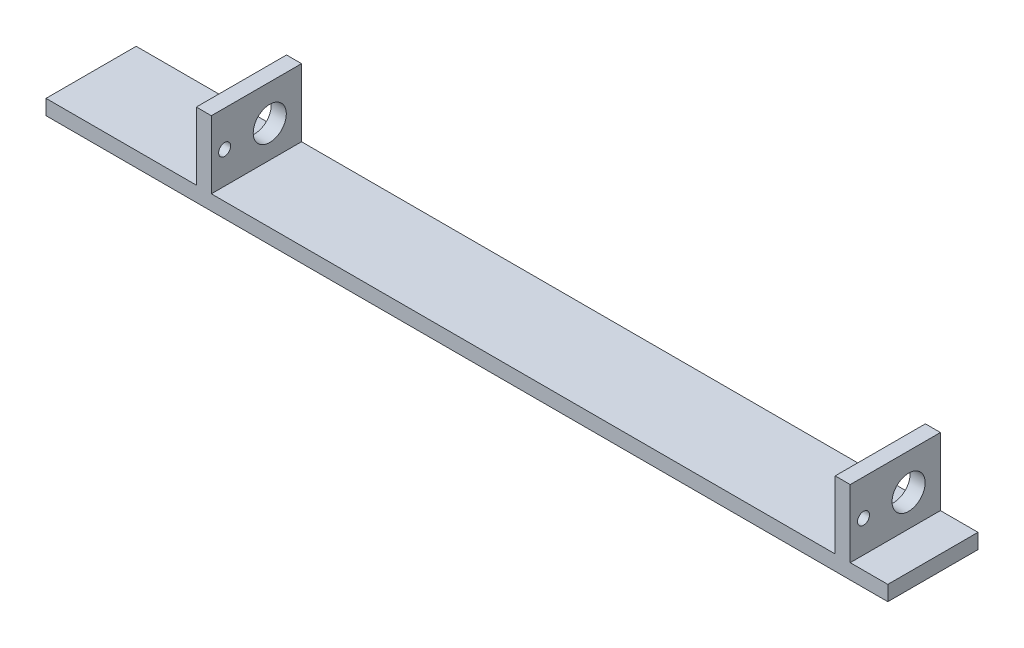
ISO-10303-21;
HEADER;
FILE_DESCRIPTION(('STEP AP214'),'2;1');
FILE_NAME('part.step','',(''),(''),'','','');
FILE_SCHEMA(('AUTOMOTIVE_DESIGN { 1 0 10303 214 1 1 1 1 }'));
ENDSEC;
DATA;
#1=APPLICATION_CONTEXT('core data for automotive mechanical design processes');
#2=APPLICATION_PROTOCOL_DEFINITION('international standard','automotive_design',2000,#1);
#3=PRODUCT_CONTEXT('',#1,'mechanical');
#4=PRODUCT('Part','Part','',(#3));
#5=PRODUCT_RELATED_PRODUCT_CATEGORY('part','',(#4));
#6=PRODUCT_DEFINITION_FORMATION('','',#4);
#7=PRODUCT_DEFINITION_CONTEXT('part definition',#1,'design');
#8=PRODUCT_DEFINITION('design','',#6,#7);
#9=PRODUCT_DEFINITION_SHAPE('','',#8);
#10=(LENGTH_UNIT() NAMED_UNIT(*) SI_UNIT(.MILLI.,.METRE.));
#11=(NAMED_UNIT(*) PLANE_ANGLE_UNIT() SI_UNIT($,.RADIAN.));
#12=(NAMED_UNIT(*) SI_UNIT($,.STERADIAN.) SOLID_ANGLE_UNIT());
#13=UNCERTAINTY_MEASURE_WITH_UNIT(LENGTH_MEASURE(1.E-05),#10,'distance_accuracy_value','');
#14=(GEOMETRIC_REPRESENTATION_CONTEXT(3) GLOBAL_UNCERTAINTY_ASSIGNED_CONTEXT((#13)) GLOBAL_UNIT_ASSIGNED_CONTEXT((#10,
#11,#12)) REPRESENTATION_CONTEXT('',''));
#15=CARTESIAN_POINT('',(0.,0.,0.));
#16=DIRECTION('',(0.,0.,1.));
#17=DIRECTION('',(1.,0.,0.));
#18=AXIS2_PLACEMENT_3D('',#15,#16,#17);
#19=CARTESIAN_POINT('',(0.,10.,0.));
#20=DIRECTION('',(0.,1.,0.));
#21=DIRECTION('',(0.,0.,1.));
#22=AXIS2_PLACEMENT_3D('',#19,#20,#21);
#23=PLANE('',#22);
#24=DIRECTION('',(1.,0.,0.));
#25=VECTOR('',#24,1.);
#26=CARTESIAN_POINT('',(-280.,10.,30.));
#27=LINE('',#26,#25);
#28=CARTESIAN_POINT('',(-170.,10.,30.));
#29=VERTEX_POINT('',#28);
#30=CARTESIAN_POINT('',(245.,10.,30.));
#31=VERTEX_POINT('',#30);
#32=EDGE_CURVE('E192',#29,#31,#27,.T.);
#33=ORIENTED_EDGE('',*,*,#32,.T.);
#34=DIRECTION('',(0.,0.,1.));
#35=VECTOR('',#34,1.);
#36=CARTESIAN_POINT('',(245.,10.,30.));
#37=LINE('',#36,#35);
#38=CARTESIAN_POINT('',(245.,10.,-30.));
#39=VERTEX_POINT('',#38);
#40=EDGE_CURVE('E50',#39,#31,#37,.T.);
#41=ORIENTED_EDGE('',*,*,#40,.F.);
#42=DIRECTION('',(-1.,0.,0.));
#43=VECTOR('',#42,1.);
#44=CARTESIAN_POINT('',(-280.,10.,-30.));
#45=LINE('',#44,#43);
#46=CARTESIAN_POINT('',(-170.,10.,-30.));
#47=VERTEX_POINT('',#46);
#48=EDGE_CURVE('E148',#39,#47,#45,.T.);
#49=ORIENTED_EDGE('',*,*,#48,.T.);
#50=DIRECTION('',(0.,0.,-1.));
#51=VECTOR('',#50,1.);
#52=CARTESIAN_POINT('',(-170.,10.,30.));
#53=LINE('',#52,#51);
#54=EDGE_CURVE('E152',#29,#47,#53,.T.);
#55=ORIENTED_EDGE('',*,*,#54,.F.);
#56=EDGE_LOOP('',(#33,#41,#49,#55));
#57=FACE_BOUND('',#56,.T.);
#58=ADVANCED_FACE('F35',(#57),#23,.T.);
#59=CARTESIAN_POINT('',(280.,10.,-30.));
#60=VERTEX_POINT('',#59);
#61=CARTESIAN_POINT('',(255.,10.,-30.));
#62=VERTEX_POINT('',#61);
#63=EDGE_CURVE('E58',#60,#62,#45,.T.);
#64=ORIENTED_EDGE('',*,*,#63,.T.);
#65=DIRECTION('',(0.,0.,-1.));
#66=VECTOR('',#65,1.);
#67=CARTESIAN_POINT('',(255.,10.,-30.));
#68=LINE('',#67,#66);
#69=CARTESIAN_POINT('',(255.,10.,30.));
#70=VERTEX_POINT('',#69);
#71=EDGE_CURVE('E144',#70,#62,#68,.T.);
#72=ORIENTED_EDGE('',*,*,#71,.F.);
#73=CARTESIAN_POINT('',(280.,10.,30.));
#74=VERTEX_POINT('',#73);
#75=EDGE_CURVE('E188',#70,#74,#27,.T.);
#76=ORIENTED_EDGE('',*,*,#75,.T.);
#77=DIRECTION('',(0.,0.,-1.));
#78=VECTOR('',#77,1.);
#79=CARTESIAN_POINT('',(280.,10.,-30.));
#80=LINE('',#79,#78);
#81=EDGE_CURVE('E181',#74,#60,#80,.T.);
#82=ORIENTED_EDGE('',*,*,#81,.T.);
#83=EDGE_LOOP('',(#64,#72,#76,#82));
#84=FACE_BOUND('',#83,.T.);
#85=ADVANCED_FACE('F251',(#84),#23,.T.);
#86=CARTESIAN_POINT('',(280.,10.,-30.));
#87=DIRECTION('',(-1.,0.,0.));
#88=DIRECTION('',(0.,0.,1.));
#89=AXIS2_PLACEMENT_3D('',#86,#87,#88);
#90=PLANE('',#89);
#91=DIRECTION('',(0.,0.,-1.));
#92=VECTOR('',#91,1.);
#93=CARTESIAN_POINT('',(280.,0.,-30.));
#94=LINE('',#93,#92);
#95=CARTESIAN_POINT('',(280.,0.,30.));
#96=VERTEX_POINT('',#95);
#97=CARTESIAN_POINT('',(280.,0.,-30.));
#98=VERTEX_POINT('',#97);
#99=EDGE_CURVE('E180',#96,#98,#94,.T.);
#100=ORIENTED_EDGE('',*,*,#99,.T.);
#101=DIRECTION('',(0.,-1.,0.));
#102=VECTOR('',#101,1.);
#103=CARTESIAN_POINT('',(280.,10.,-30.));
#104=LINE('',#103,#102);
#105=EDGE_CURVE('E208',#60,#98,#104,.T.);
#106=ORIENTED_EDGE('',*,*,#105,.F.);
#107=ORIENTED_EDGE('',*,*,#81,.F.);
#108=DIRECTION('',(0.,-1.,0.));
#109=VECTOR('',#108,1.);
#110=CARTESIAN_POINT('',(280.,10.,30.));
#111=LINE('',#110,#109);
#112=EDGE_CURVE('E191',#74,#96,#111,.T.);
#113=ORIENTED_EDGE('',*,*,#112,.T.);
#114=EDGE_LOOP('',(#100,#106,#107,#113));
#115=FACE_BOUND('',#114,.T.);
#116=ADVANCED_FACE('F37',(#115),#90,.F.);
#117=CARTESIAN_POINT('',(-280.,10.,-30.));
#118=DIRECTION('',(0.,0.,1.));
#119=DIRECTION('',(1.,0.,0.));
#120=AXIS2_PLACEMENT_3D('',#117,#118,#119);
#121=PLANE('',#120);
#122=DIRECTION('',(-1.,0.,0.));
#123=VECTOR('',#122,1.);
#124=CARTESIAN_POINT('',(-280.,0.,-30.));
#125=LINE('',#124,#123);
#126=CARTESIAN_POINT('',(-280.,0.,-30.));
#127=VERTEX_POINT('',#126);
#128=EDGE_CURVE('E195',#98,#127,#125,.T.);
#129=ORIENTED_EDGE('',*,*,#128,.T.);
#130=DIRECTION('',(0.,-1.,0.));
#131=VECTOR('',#130,1.);
#132=CARTESIAN_POINT('',(-280.,10.,-30.));
#133=LINE('',#132,#131);
#134=CARTESIAN_POINT('',(-280.,10.,-30.));
#135=VERTEX_POINT('',#134);
#136=EDGE_CURVE('E205',#135,#127,#133,.T.);
#137=ORIENTED_EDGE('',*,*,#136,.F.);
#138=CARTESIAN_POINT('',(-180.,10.,-30.));
#139=VERTEX_POINT('',#138);
#140=EDGE_CURVE('E183',#139,#135,#45,.T.);
#141=ORIENTED_EDGE('',*,*,#140,.F.);
#142=DIRECTION('',(0.,-1.,0.));
#143=VECTOR('',#142,1.);
#144=CARTESIAN_POINT('',(-180.,55.,-30.));
#145=LINE('',#144,#143);
#146=CARTESIAN_POINT('',(-180.,55.,-30.));
#147=VERTEX_POINT('',#146);
#148=EDGE_CURVE('E177',#147,#139,#145,.T.);
#149=ORIENTED_EDGE('',*,*,#148,.F.);
#150=DIRECTION('',(-1.,0.,0.));
#151=VECTOR('',#150,1.);
#152=CARTESIAN_POINT('',(-170.,55.,-30.));
#153=LINE('',#152,#151);
#154=CARTESIAN_POINT('',(-170.,55.,-30.));
#155=VERTEX_POINT('',#154);
#156=EDGE_CURVE('E158',#155,#147,#153,.T.);
#157=ORIENTED_EDGE('',*,*,#156,.F.);
#158=DIRECTION('',(0.,-1.,0.));
#159=VECTOR('',#158,1.);
#160=CARTESIAN_POINT('',(-170.,55.,-30.));
#161=LINE('',#160,#159);
#162=EDGE_CURVE('E166',#155,#47,#161,.T.);
#163=ORIENTED_EDGE('',*,*,#162,.T.);
#164=ORIENTED_EDGE('',*,*,#48,.F.);
#165=DIRECTION('',(0.,-1.,0.));
#166=VECTOR('',#165,1.);
#167=CARTESIAN_POINT('',(245.,55.,-30.));
#168=LINE('',#167,#166);
#169=CARTESIAN_POINT('',(245.,55.,-30.));
#170=VERTEX_POINT('',#169);
#171=EDGE_CURVE('E129',#170,#39,#168,.T.);
#172=ORIENTED_EDGE('',*,*,#171,.F.);
#173=DIRECTION('',(-1.,0.,0.));
#174=VECTOR('',#173,1.);
#175=CARTESIAN_POINT('',(245.,55.,-30.));
#176=LINE('',#175,#174);
#177=CARTESIAN_POINT('',(255.,55.,-30.));
#178=VERTEX_POINT('',#177);
#179=EDGE_CURVE('E135',#178,#170,#176,.T.);
#180=ORIENTED_EDGE('',*,*,#179,.F.);
#181=DIRECTION('',(0.,-1.,0.));
#182=VECTOR('',#181,1.);
#183=CARTESIAN_POINT('',(255.,55.,-30.));
#184=LINE('',#183,#182);
#185=EDGE_CURVE('E250',#178,#62,#184,.T.);
#186=ORIENTED_EDGE('',*,*,#185,.T.);
#187=ORIENTED_EDGE('',*,*,#63,.F.);
#188=ORIENTED_EDGE('',*,*,#105,.T.);
#189=EDGE_LOOP('',(#129,#137,#141,#149,#157,#163,#164,#172,#180,#186,#187,#188));
#190=FACE_BOUND('',#189,.T.);
#191=ADVANCED_FACE('F146',(#190),#121,.F.);
#192=CARTESIAN_POINT('',(-280.,10.,-30.));
#193=DIRECTION('',(1.,0.,0.));
#194=DIRECTION('',(0.,0.,-1.));
#195=AXIS2_PLACEMENT_3D('',#192,#193,#194);
#196=PLANE('',#195);
#197=DIRECTION('',(0.,0.,1.));
#198=VECTOR('',#197,1.);
#199=CARTESIAN_POINT('',(-280.,0.,-30.));
#200=LINE('',#199,#198);
#201=CARTESIAN_POINT('',(-280.,0.,30.));
#202=VERTEX_POINT('',#201);
#203=EDGE_CURVE('E197',#127,#202,#200,.T.);
#204=ORIENTED_EDGE('',*,*,#203,.T.);
#205=DIRECTION('',(0.,-1.,0.));
#206=VECTOR('',#205,1.);
#207=CARTESIAN_POINT('',(-280.,10.,30.));
#208=LINE('',#207,#206);
#209=CARTESIAN_POINT('',(-280.,10.,30.));
#210=VERTEX_POINT('',#209);
#211=EDGE_CURVE('E202',#210,#202,#208,.T.);
#212=ORIENTED_EDGE('',*,*,#211,.F.);
#213=DIRECTION('',(0.,0.,1.));
#214=VECTOR('',#213,1.);
#215=CARTESIAN_POINT('',(-280.,10.,-30.));
#216=LINE('',#215,#214);
#217=EDGE_CURVE('E186',#135,#210,#216,.T.);
#218=ORIENTED_EDGE('',*,*,#217,.F.);
#219=ORIENTED_EDGE('',*,*,#136,.T.);
#220=EDGE_LOOP('',(#204,#212,#218,#219));
#221=FACE_BOUND('',#220,.T.);
#222=ADVANCED_FACE('F246',(#221),#196,.F.);
#223=CARTESIAN_POINT('',(-280.,10.,30.));
#224=DIRECTION('',(0.,0.,-1.));
#225=DIRECTION('',(-1.,0.,0.));
#226=AXIS2_PLACEMENT_3D('',#223,#224,#225);
#227=PLANE('',#226);
#228=DIRECTION('',(1.,0.,0.));
#229=VECTOR('',#228,1.);
#230=CARTESIAN_POINT('',(-280.,0.,30.));
#231=LINE('',#230,#229);
#232=EDGE_CURVE('E184',#202,#96,#231,.T.);
#233=ORIENTED_EDGE('',*,*,#232,.T.);
#234=ORIENTED_EDGE('',*,*,#112,.F.);
#235=ORIENTED_EDGE('',*,*,#75,.F.);
#236=DIRECTION('',(0.,-1.,0.));
#237=VECTOR('',#236,1.);
#238=CARTESIAN_POINT('',(255.,55.,30.));
#239=LINE('',#238,#237);
#240=CARTESIAN_POINT('',(255.,55.,30.));
#241=VERTEX_POINT('',#240);
#242=EDGE_CURVE('E154',#241,#70,#239,.T.);
#243=ORIENTED_EDGE('',*,*,#242,.F.);
#244=DIRECTION('',(1.,0.,0.));
#245=VECTOR('',#244,1.);
#246=CARTESIAN_POINT('',(255.,55.,30.));
#247=LINE('',#246,#245);
#248=CARTESIAN_POINT('',(245.,55.,30.));
#249=VERTEX_POINT('',#248);
#250=EDGE_CURVE('E134',#249,#241,#247,.T.);
#251=ORIENTED_EDGE('',*,*,#250,.F.);
#252=DIRECTION('',(0.,-1.,0.));
#253=VECTOR('',#252,1.);
#254=CARTESIAN_POINT('',(245.,55.,30.));
#255=LINE('',#254,#253);
#256=EDGE_CURVE('E131',#249,#31,#255,.T.);
#257=ORIENTED_EDGE('',*,*,#256,.T.);
#258=ORIENTED_EDGE('',*,*,#32,.F.);
#259=DIRECTION('',(0.,-1.,0.));
#260=VECTOR('',#259,1.);
#261=CARTESIAN_POINT('',(-170.,55.,30.));
#262=LINE('',#261,#260);
#263=CARTESIAN_POINT('',(-170.,55.,30.));
#264=VERTEX_POINT('',#263);
#265=EDGE_CURVE('E171',#264,#29,#262,.T.);
#266=ORIENTED_EDGE('',*,*,#265,.F.);
#267=DIRECTION('',(1.,0.,0.));
#268=VECTOR('',#267,1.);
#269=CARTESIAN_POINT('',(-180.,55.,30.));
#270=LINE('',#269,#268);
#271=CARTESIAN_POINT('',(-180.,55.,30.));
#272=VERTEX_POINT('',#271);
#273=EDGE_CURVE('E163',#272,#264,#270,.T.);
#274=ORIENTED_EDGE('',*,*,#273,.F.);
#275=DIRECTION('',(0.,-1.,0.));
#276=VECTOR('',#275,1.);
#277=CARTESIAN_POINT('',(-180.,55.,30.));
#278=LINE('',#277,#276);
#279=CARTESIAN_POINT('',(-180.,10.,30.));
#280=VERTEX_POINT('',#279);
#281=EDGE_CURVE('E174',#272,#280,#278,.T.);
#282=ORIENTED_EDGE('',*,*,#281,.T.);
#283=EDGE_CURVE('E189',#210,#280,#27,.T.);
#284=ORIENTED_EDGE('',*,*,#283,.F.);
#285=ORIENTED_EDGE('',*,*,#211,.T.);
#286=EDGE_LOOP('',(#233,#234,#235,#243,#251,#257,#258,#266,#274,#282,#284,#285));
#287=FACE_BOUND('',#286,.T.);
#288=ADVANCED_FACE('F240',(#287),#227,.F.);
#289=DIRECTION('',(0.,0.,1.));
#290=VECTOR('',#289,1.);
#291=CARTESIAN_POINT('',(-180.,10.,-30.));
#292=LINE('',#291,#290);
#293=EDGE_CURVE('E149',#139,#280,#292,.T.);
#294=ORIENTED_EDGE('',*,*,#293,.F.);
#295=ORIENTED_EDGE('',*,*,#140,.T.);
#296=ORIENTED_EDGE('',*,*,#217,.T.);
#297=ORIENTED_EDGE('',*,*,#283,.T.);
#298=EDGE_LOOP('',(#294,#295,#296,#297));
#299=FACE_BOUND('',#298,.T.);
#300=ADVANCED_FACE('F229',(#299),#23,.T.);
#301=CARTESIAN_POINT('',(0.,0.,0.));
#302=DIRECTION('',(0.,1.,0.));
#303=DIRECTION('',(0.,0.,1.));
#304=AXIS2_PLACEMENT_3D('',#301,#302,#303);
#305=PLANE('',#304);
#306=CARTESIAN_POINT('',(260.,0.,0.));
#307=DIRECTION('',(0.,1.,0.));
#308=DIRECTION('',(0.,0.,1.));
#309=AXIS2_PLACEMENT_3D('',#306,#307,#308);
#310=CIRCLE('',#309,4.99999999999999);
#311=CARTESIAN_POINT('',(260.,0.,4.99999999999999));
#312=VERTEX_POINT('',#311);
#313=EDGE_CURVE('E11',#312,#312,#310,.F.);
#314=ORIENTED_EDGE('',*,*,#313,.F.);
#315=EDGE_LOOP('',(#314));
#316=FACE_BOUND('',#315,.T.);
#317=CARTESIAN_POINT('',(-270.,0.,0.));
#318=DIRECTION('',(0.,1.,0.));
#319=DIRECTION('',(0.,0.,1.));
#320=AXIS2_PLACEMENT_3D('',#317,#318,#319);
#321=CIRCLE('',#320,4.99999999999999);
#322=CARTESIAN_POINT('',(-270.,0.,5.));
#323=VERTEX_POINT('',#322);
#324=EDGE_CURVE('E43',#323,#323,#321,.F.);
#325=ORIENTED_EDGE('',*,*,#324,.F.);
#326=EDGE_LOOP('',(#325));
#327=FACE_BOUND('',#326,.T.);
#328=ORIENTED_EDGE('',*,*,#99,.F.);
#329=ORIENTED_EDGE('',*,*,#232,.F.);
#330=ORIENTED_EDGE('',*,*,#203,.F.);
#331=ORIENTED_EDGE('',*,*,#128,.F.);
#332=EDGE_LOOP('',(#328,#329,#330,#331));
#333=FACE_BOUND('',#332,.T.);
#334=ADVANCED_FACE('F225',(#316,#327,#333),#305,.F.);
#335=CARTESIAN_POINT('',(-180.,55.,-30.));
#336=DIRECTION('',(1.,0.,0.));
#337=DIRECTION('',(0.,0.,-1.));
#338=AXIS2_PLACEMENT_3D('',#335,#336,#337);
#339=PLANE('',#338);
#340=CARTESIAN_POINT('',(-180.,31.15,-8.85));
#341=DIRECTION('',(-1.,0.,0.));
#342=DIRECTION('',(0.,0.,1.));
#343=AXIS2_PLACEMENT_3D('',#340,#341,#342);
#344=CIRCLE('',#343,11.);
#345=CARTESIAN_POINT('',(-180.,31.15,2.15));
#346=VERTEX_POINT('',#345);
#347=EDGE_CURVE('E215',#346,#346,#344,.T.);
#348=ORIENTED_EDGE('',*,*,#347,.F.);
#349=EDGE_LOOP('',(#348));
#350=FACE_BOUND('',#349,.T.);
#351=CARTESIAN_POINT('',(-180.,31.15,21.15));
#352=DIRECTION('',(-1.,0.,0.));
#353=DIRECTION('',(0.,0.,1.));
#354=AXIS2_PLACEMENT_3D('',#351,#352,#353);
#355=CIRCLE('',#354,4.);
#356=CARTESIAN_POINT('',(-180.,31.15,25.15));
#357=VERTEX_POINT('',#356);
#358=EDGE_CURVE('E348',#357,#357,#355,.T.);
#359=ORIENTED_EDGE('',*,*,#358,.F.);
#360=EDGE_LOOP('',(#359));
#361=FACE_BOUND('',#360,.T.);
#362=ORIENTED_EDGE('',*,*,#293,.T.);
#363=ORIENTED_EDGE('',*,*,#281,.F.);
#364=DIRECTION('',(0.,0.,1.));
#365=VECTOR('',#364,1.);
#366=CARTESIAN_POINT('',(-180.,55.,-30.));
#367=LINE('',#366,#365);
#368=EDGE_CURVE('E161',#147,#272,#367,.T.);
#369=ORIENTED_EDGE('',*,*,#368,.F.);
#370=ORIENTED_EDGE('',*,*,#148,.T.);
#371=EDGE_LOOP('',(#362,#363,#369,#370));
#372=FACE_BOUND('',#371,.T.);
#373=ADVANCED_FACE('F228',(#350,#361,#372),#339,.F.);
#374=CARTESIAN_POINT('',(-170.,55.,30.));
#375=DIRECTION('',(-1.,0.,0.));
#376=DIRECTION('',(0.,0.,1.));
#377=AXIS2_PLACEMENT_3D('',#374,#375,#376);
#378=PLANE('',#377);
#379=CARTESIAN_POINT('',(-170.,31.15,-8.85));
#380=DIRECTION('',(-1.,0.,0.));
#381=DIRECTION('',(0.,0.,1.));
#382=AXIS2_PLACEMENT_3D('',#379,#380,#381);
#383=CIRCLE('',#382,11.);
#384=CARTESIAN_POINT('',(-170.,31.15,2.15));
#385=VERTEX_POINT('',#384);
#386=EDGE_CURVE('E255',#385,#385,#383,.T.);
#387=ORIENTED_EDGE('',*,*,#386,.T.);
#388=EDGE_LOOP('',(#387));
#389=FACE_BOUND('',#388,.T.);
#390=CARTESIAN_POINT('',(-170.,31.15,21.15));
#391=DIRECTION('',(-1.,0.,0.));
#392=DIRECTION('',(0.,0.,1.));
#393=AXIS2_PLACEMENT_3D('',#390,#391,#392);
#394=CIRCLE('',#393,4.);
#395=CARTESIAN_POINT('',(-170.,31.15,25.15));
#396=VERTEX_POINT('',#395);
#397=EDGE_CURVE('E219',#396,#396,#394,.T.);
#398=ORIENTED_EDGE('',*,*,#397,.T.);
#399=EDGE_LOOP('',(#398));
#400=FACE_BOUND('',#399,.T.);
#401=ORIENTED_EDGE('',*,*,#54,.T.);
#402=ORIENTED_EDGE('',*,*,#162,.F.);
#403=DIRECTION('',(0.,0.,-1.));
#404=VECTOR('',#403,1.);
#405=CARTESIAN_POINT('',(-170.,55.,30.));
#406=LINE('',#405,#404);
#407=EDGE_CURVE('E165',#264,#155,#406,.T.);
#408=ORIENTED_EDGE('',*,*,#407,.F.);
#409=ORIENTED_EDGE('',*,*,#265,.T.);
#410=EDGE_LOOP('',(#401,#402,#408,#409));
#411=FACE_BOUND('',#410,.T.);
#412=ADVANCED_FACE('F297',(#389,#400,#411),#378,.F.);
#413=CARTESIAN_POINT('',(0.,55.,0.));
#414=DIRECTION('',(0.,1.,0.));
#415=DIRECTION('',(0.,0.,1.));
#416=AXIS2_PLACEMENT_3D('',#413,#414,#415);
#417=PLANE('',#416);
#418=ORIENTED_EDGE('',*,*,#156,.T.);
#419=ORIENTED_EDGE('',*,*,#368,.T.);
#420=ORIENTED_EDGE('',*,*,#273,.T.);
#421=ORIENTED_EDGE('',*,*,#407,.T.);
#422=EDGE_LOOP('',(#418,#419,#420,#421));
#423=FACE_BOUND('',#422,.T.);
#424=ADVANCED_FACE('F272',(#423),#417,.T.);
#425=CARTESIAN_POINT('',(245.,55.,30.));
#426=DIRECTION('',(1.,0.,0.));
#427=DIRECTION('',(0.,0.,-1.));
#428=AXIS2_PLACEMENT_3D('',#425,#426,#427);
#429=PLANE('',#428);
#430=CARTESIAN_POINT('',(245.,31.15,-8.85));
#431=DIRECTION('',(1.,0.,0.));
#432=DIRECTION('',(0.,0.,-1.));
#433=AXIS2_PLACEMENT_3D('',#430,#431,#432);
#434=CIRCLE('',#433,11.);
#435=CARTESIAN_POINT('',(245.,31.15,2.15));
#436=VERTEX_POINT('',#435);
#437=EDGE_CURVE('E218',#436,#436,#434,.T.);
#438=ORIENTED_EDGE('',*,*,#437,.T.);
#439=EDGE_LOOP('',(#438));
#440=FACE_BOUND('',#439,.T.);
#441=CARTESIAN_POINT('',(245.,31.15,21.15));
#442=DIRECTION('',(1.,0.,0.));
#443=DIRECTION('',(0.,0.,-1.));
#444=AXIS2_PLACEMENT_3D('',#441,#442,#443);
#445=CIRCLE('',#444,4.);
#446=CARTESIAN_POINT('',(245.,31.15,25.15));
#447=VERTEX_POINT('',#446);
#448=EDGE_CURVE('E214',#447,#447,#445,.T.);
#449=ORIENTED_EDGE('',*,*,#448,.T.);
#450=EDGE_LOOP('',(#449));
#451=FACE_BOUND('',#450,.T.);
#452=ORIENTED_EDGE('',*,*,#40,.T.);
#453=ORIENTED_EDGE('',*,*,#256,.F.);
#454=DIRECTION('',(0.,0.,1.));
#455=VECTOR('',#454,1.);
#456=CARTESIAN_POINT('',(245.,55.,30.));
#457=LINE('',#456,#455);
#458=EDGE_CURVE('E125',#170,#249,#457,.T.);
#459=ORIENTED_EDGE('',*,*,#458,.F.);
#460=ORIENTED_EDGE('',*,*,#171,.T.);
#461=EDGE_LOOP('',(#452,#453,#459,#460));
#462=FACE_BOUND('',#461,.T.);
#463=ADVANCED_FACE('F127',(#440,#451,#462),#429,.F.);
#464=CARTESIAN_POINT('',(255.,55.,-30.));
#465=DIRECTION('',(-1.,0.,0.));
#466=DIRECTION('',(0.,0.,1.));
#467=AXIS2_PLACEMENT_3D('',#464,#465,#466);
#468=PLANE('',#467);
#469=CARTESIAN_POINT('',(255.,31.15,-8.85));
#470=DIRECTION('',(-1.,0.,0.));
#471=DIRECTION('',(0.,0.,1.));
#472=AXIS2_PLACEMENT_3D('',#469,#470,#471);
#473=CIRCLE('',#472,11.);
#474=CARTESIAN_POINT('',(255.,31.15,2.15));
#475=VERTEX_POINT('',#474);
#476=EDGE_CURVE('E216',#475,#475,#473,.T.);
#477=ORIENTED_EDGE('',*,*,#476,.T.);
#478=EDGE_LOOP('',(#477));
#479=FACE_BOUND('',#478,.T.);
#480=CARTESIAN_POINT('',(255.,31.15,21.15));
#481=DIRECTION('',(-1.,0.,0.));
#482=DIRECTION('',(0.,0.,1.));
#483=AXIS2_PLACEMENT_3D('',#480,#481,#482);
#484=CIRCLE('',#483,4.);
#485=CARTESIAN_POINT('',(255.,31.15,25.15));
#486=VERTEX_POINT('',#485);
#487=EDGE_CURVE('E211',#486,#486,#484,.T.);
#488=ORIENTED_EDGE('',*,*,#487,.T.);
#489=EDGE_LOOP('',(#488));
#490=FACE_BOUND('',#489,.T.);
#491=ORIENTED_EDGE('',*,*,#71,.T.);
#492=ORIENTED_EDGE('',*,*,#185,.F.);
#493=DIRECTION('',(0.,0.,-1.));
#494=VECTOR('',#493,1.);
#495=CARTESIAN_POINT('',(255.,55.,-30.));
#496=LINE('',#495,#494);
#497=EDGE_CURVE('E140',#241,#178,#496,.T.);
#498=ORIENTED_EDGE('',*,*,#497,.F.);
#499=ORIENTED_EDGE('',*,*,#242,.T.);
#500=EDGE_LOOP('',(#491,#492,#498,#499));
#501=FACE_BOUND('',#500,.T.);
#502=ADVANCED_FACE('F262',(#479,#490,#501),#468,.F.);
#503=CARTESIAN_POINT('',(0.,55.,0.));
#504=DIRECTION('',(0.,-1.,0.));
#505=DIRECTION('',(0.,0.,-1.));
#506=AXIS2_PLACEMENT_3D('',#503,#504,#505);
#507=PLANE('',#506);
#508=ORIENTED_EDGE('',*,*,#179,.T.);
#509=ORIENTED_EDGE('',*,*,#458,.T.);
#510=ORIENTED_EDGE('',*,*,#250,.T.);
#511=ORIENTED_EDGE('',*,*,#497,.T.);
#512=EDGE_LOOP('',(#508,#509,#510,#511));
#513=FACE_BOUND('',#512,.T.);
#514=ADVANCED_FACE('F138',(#513),#507,.F.);
#515=CARTESIAN_POINT('',(260.,31.15,21.15));
#516=DIRECTION('',(-1.,0.,0.));
#517=DIRECTION('',(0.,0.,1.));
#518=AXIS2_PLACEMENT_3D('',#515,#516,#517);
#519=CYLINDRICAL_SURFACE('',#518,4.);
#520=CARTESIAN_POINT('',(255.,31.15,25.15));
#521=CARTESIAN_POINT('',(254.895833333333,31.15,25.15));
#522=CARTESIAN_POINT('',(254.791666666667,31.15,25.15));
#523=CARTESIAN_POINT('',(254.583333333333,31.15,25.15));
#524=CARTESIAN_POINT('',(254.479166666667,31.15,25.15));
#525=CARTESIAN_POINT('',(254.270833333333,31.15,25.15));
#526=CARTESIAN_POINT('',(254.166666666667,31.15,25.15));
#527=CARTESIAN_POINT('',(253.958333333333,31.15,25.15));
#528=CARTESIAN_POINT('',(253.854166666667,31.15,25.15));
#529=CARTESIAN_POINT('',(253.645833333333,31.15,25.15));
#530=CARTESIAN_POINT('',(253.541666666667,31.15,25.15));
#531=CARTESIAN_POINT('',(253.333333333333,31.15,25.15));
#532=CARTESIAN_POINT('',(253.229166666667,31.15,25.15));
#533=CARTESIAN_POINT('',(253.020833333333,31.15,25.15));
#534=CARTESIAN_POINT('',(252.916666666667,31.15,25.15));
#535=CARTESIAN_POINT('',(252.708333333333,31.15,25.15));
#536=CARTESIAN_POINT('',(252.604166666667,31.15,25.15));
#537=CARTESIAN_POINT('',(252.395833333333,31.15,25.15));
#538=CARTESIAN_POINT('',(252.291666666667,31.15,25.15));
#539=CARTESIAN_POINT('',(252.083333333333,31.15,25.15));
#540=CARTESIAN_POINT('',(251.979166666667,31.15,25.15));
#541=CARTESIAN_POINT('',(251.770833333333,31.15,25.15));
#542=CARTESIAN_POINT('',(251.666666666667,31.15,25.15));
#543=CARTESIAN_POINT('',(251.458333333333,31.15,25.15));
#544=CARTESIAN_POINT('',(251.354166666667,31.15,25.15));
#545=CARTESIAN_POINT('',(251.145833333333,31.15,25.15));
#546=CARTESIAN_POINT('',(251.041666666667,31.15,25.15));
#547=CARTESIAN_POINT('',(250.833333333333,31.15,25.15));
#548=CARTESIAN_POINT('',(250.729166666667,31.15,25.15));
#549=CARTESIAN_POINT('',(250.520833333333,31.15,25.15));
#550=CARTESIAN_POINT('',(250.416666666667,31.15,25.15));
#551=CARTESIAN_POINT('',(250.208333333333,31.15,25.15));
#552=CARTESIAN_POINT('',(250.104166666667,31.15,25.15));
#553=CARTESIAN_POINT('',(249.895833333333,31.15,25.15));
#554=CARTESIAN_POINT('',(249.791666666667,31.15,25.15));
#555=CARTESIAN_POINT('',(249.583333333333,31.15,25.15));
#556=CARTESIAN_POINT('',(249.479166666667,31.15,25.15));
#557=CARTESIAN_POINT('',(249.270833333333,31.15,25.15));
#558=CARTESIAN_POINT('',(249.166666666667,31.15,25.15));
#559=CARTESIAN_POINT('',(248.958333333333,31.15,25.15));
#560=CARTESIAN_POINT('',(248.854166666667,31.15,25.15));
#561=CARTESIAN_POINT('',(248.645833333333,31.15,25.15));
#562=CARTESIAN_POINT('',(248.541666666667,31.15,25.15));
#563=CARTESIAN_POINT('',(248.333333333333,31.15,25.15));
#564=CARTESIAN_POINT('',(248.229166666667,31.15,25.15));
#565=CARTESIAN_POINT('',(248.020833333333,31.15,25.15));
#566=CARTESIAN_POINT('',(247.916666666667,31.15,25.15));
#567=CARTESIAN_POINT('',(247.708333333333,31.15,25.15));
#568=CARTESIAN_POINT('',(247.604166666667,31.15,25.15));
#569=CARTESIAN_POINT('',(247.395833333333,31.15,25.15));
#570=CARTESIAN_POINT('',(247.291666666667,31.15,25.15));
#571=CARTESIAN_POINT('',(247.083333333333,31.15,25.15));
#572=CARTESIAN_POINT('',(246.979166666667,31.15,25.15));
#573=CARTESIAN_POINT('',(246.770833333333,31.15,25.15));
#574=CARTESIAN_POINT('',(246.666666666667,31.15,25.15));
#575=CARTESIAN_POINT('',(246.458333333333,31.15,25.15));
#576=CARTESIAN_POINT('',(246.354166666667,31.15,25.15));
#577=CARTESIAN_POINT('',(246.145833333333,31.15,25.15));
#578=CARTESIAN_POINT('',(246.041666666667,31.15,25.15));
#579=CARTESIAN_POINT('',(245.833333333333,31.15,25.15));
#580=CARTESIAN_POINT('',(245.729166666667,31.15,25.15));
#581=CARTESIAN_POINT('',(245.520833333333,31.15,25.15));
#582=CARTESIAN_POINT('',(245.416666666667,31.15,25.15));
#583=CARTESIAN_POINT('',(245.208333333333,31.15,25.15));
#584=CARTESIAN_POINT('',(245.104166666667,31.15,25.15));
#585=CARTESIAN_POINT('',(245.,31.15,25.15));
#586=B_SPLINE_CURVE_WITH_KNOTS('',3,(#520,#521,#522,#523,#524,#525,#526,#527,#528,#529,#530,
#531,#532,#533,#534,#535,#536,#537,#538,#539,#540,#541,#542,#543,#544,#545,#546,#547,#548,#549,
#550,#551,#552,#553,#554,#555,#556,#557,#558,#559,#560,#561,#562,#563,#564,#565,#566,#567,#568,
#569,#570,#571,#572,#573,#574,#575,#576,#577,#578,#579,#580,#581,#582,#583,#584,#585),
.UNSPECIFIED.,.F.,.F.,(4,2,2,2,2,2,2,2,2,2,2,2,2,2,2,2,2,2,2,2,2,2,2,2,2,2,2,2,2,2,2,2,4),(0.,
0.312499999999993,0.624999999999987,0.93749999999998,1.24999999999997,1.56249999999997,
1.87499999999996,2.18750000000001,2.5,2.8125,3.12499999999999,3.43749999999998,3.74999999999998,
4.06249999999997,4.37500000000002,4.68750000000001,5.,5.3125,5.62499999999999,5.93750000000001,
6.25000000000001,6.5625,6.87500000000002,7.18750000000001,7.50000000000001,7.8125,
8.12500000000002,8.43750000000001,8.75000000000001,9.06250000000003,9.37500000000002,
9.68750000000002,10.),.UNSPECIFIED.);
#587=EDGE_CURVE('BSEAM270',#486,#447,#586,.T.);
#588=ORIENTED_EDGE('',*,*,#487,.F.);
#589=ORIENTED_EDGE('',*,*,#448,.F.);
#590=ORIENTED_EDGE('',*,*,#587,.T.);
#591=ORIENTED_EDGE('',*,*,#587,.F.);
#592=EDGE_LOOP('',(#588,#590,#589,#591));
#593=FACE_BOUND('',#592,.T.);
#594=ADVANCED_FACE('F270',(#593),#519,.F.);
#595=CARTESIAN_POINT('',(260.,31.15,-8.85));
#596=DIRECTION('',(-1.,0.,0.));
#597=DIRECTION('',(0.,0.,1.));
#598=AXIS2_PLACEMENT_3D('',#595,#596,#597);
#599=CYLINDRICAL_SURFACE('',#598,11.);
#600=CARTESIAN_POINT('',(255.,31.15,2.15));
#601=CARTESIAN_POINT('',(254.895833333333,31.15,2.15));
#602=CARTESIAN_POINT('',(254.791666666667,31.15,2.15));
#603=CARTESIAN_POINT('',(254.583333333333,31.15,2.15));
#604=CARTESIAN_POINT('',(254.479166666667,31.15,2.15));
#605=CARTESIAN_POINT('',(254.270833333333,31.15,2.15));
#606=CARTESIAN_POINT('',(254.166666666667,31.15,2.15));
#607=CARTESIAN_POINT('',(253.958333333333,31.15,2.15));
#608=CARTESIAN_POINT('',(253.854166666667,31.15,2.15));
#609=CARTESIAN_POINT('',(253.645833333333,31.15,2.15));
#610=CARTESIAN_POINT('',(253.541666666667,31.15,2.15));
#611=CARTESIAN_POINT('',(253.333333333333,31.15,2.15));
#612=CARTESIAN_POINT('',(253.229166666667,31.15,2.15));
#613=CARTESIAN_POINT('',(253.020833333333,31.15,2.15));
#614=CARTESIAN_POINT('',(252.916666666667,31.15,2.15));
#615=CARTESIAN_POINT('',(252.708333333333,31.15,2.15));
#616=CARTESIAN_POINT('',(252.604166666667,31.15,2.15));
#617=CARTESIAN_POINT('',(252.395833333333,31.15,2.15));
#618=CARTESIAN_POINT('',(252.291666666667,31.15,2.15));
#619=CARTESIAN_POINT('',(252.083333333333,31.15,2.15));
#620=CARTESIAN_POINT('',(251.979166666667,31.15,2.15));
#621=CARTESIAN_POINT('',(251.770833333333,31.15,2.15));
#622=CARTESIAN_POINT('',(251.666666666667,31.15,2.15));
#623=CARTESIAN_POINT('',(251.458333333333,31.15,2.15));
#624=CARTESIAN_POINT('',(251.354166666667,31.15,2.15));
#625=CARTESIAN_POINT('',(251.145833333333,31.15,2.15));
#626=CARTESIAN_POINT('',(251.041666666667,31.15,2.15));
#627=CARTESIAN_POINT('',(250.833333333333,31.15,2.15));
#628=CARTESIAN_POINT('',(250.729166666667,31.15,2.15));
#629=CARTESIAN_POINT('',(250.520833333333,31.15,2.15));
#630=CARTESIAN_POINT('',(250.416666666667,31.15,2.15));
#631=CARTESIAN_POINT('',(250.208333333333,31.15,2.15));
#632=CARTESIAN_POINT('',(250.104166666667,31.15,2.15));
#633=CARTESIAN_POINT('',(249.895833333333,31.15,2.15));
#634=CARTESIAN_POINT('',(249.791666666667,31.15,2.15));
#635=CARTESIAN_POINT('',(249.583333333333,31.15,2.15));
#636=CARTESIAN_POINT('',(249.479166666667,31.15,2.15));
#637=CARTESIAN_POINT('',(249.270833333333,31.15,2.15));
#638=CARTESIAN_POINT('',(249.166666666667,31.15,2.15));
#639=CARTESIAN_POINT('',(248.958333333333,31.15,2.15));
#640=CARTESIAN_POINT('',(248.854166666667,31.15,2.15));
#641=CARTESIAN_POINT('',(248.645833333333,31.15,2.15));
#642=CARTESIAN_POINT('',(248.541666666667,31.15,2.15));
#643=CARTESIAN_POINT('',(248.333333333333,31.15,2.15));
#644=CARTESIAN_POINT('',(248.229166666667,31.15,2.15));
#645=CARTESIAN_POINT('',(248.020833333333,31.15,2.15));
#646=CARTESIAN_POINT('',(247.916666666667,31.15,2.15));
#647=CARTESIAN_POINT('',(247.708333333333,31.15,2.15));
#648=CARTESIAN_POINT('',(247.604166666667,31.15,2.15));
#649=CARTESIAN_POINT('',(247.395833333333,31.15,2.15));
#650=CARTESIAN_POINT('',(247.291666666667,31.15,2.15));
#651=CARTESIAN_POINT('',(247.083333333333,31.15,2.15));
#652=CARTESIAN_POINT('',(246.979166666667,31.15,2.15));
#653=CARTESIAN_POINT('',(246.770833333333,31.15,2.15));
#654=CARTESIAN_POINT('',(246.666666666667,31.15,2.15));
#655=CARTESIAN_POINT('',(246.458333333333,31.15,2.15));
#656=CARTESIAN_POINT('',(246.354166666667,31.15,2.15));
#657=CARTESIAN_POINT('',(246.145833333333,31.15,2.15));
#658=CARTESIAN_POINT('',(246.041666666667,31.15,2.15));
#659=CARTESIAN_POINT('',(245.833333333333,31.15,2.15));
#660=CARTESIAN_POINT('',(245.729166666667,31.15,2.15));
#661=CARTESIAN_POINT('',(245.520833333333,31.15,2.15));
#662=CARTESIAN_POINT('',(245.416666666667,31.15,2.15));
#663=CARTESIAN_POINT('',(245.208333333333,31.15,2.15));
#664=CARTESIAN_POINT('',(245.104166666667,31.15,2.15));
#665=CARTESIAN_POINT('',(245.,31.15,2.15));
#666=B_SPLINE_CURVE_WITH_KNOTS('',3,(#600,#601,#602,#603,#604,#605,#606,#607,#608,#609,#610,
#611,#612,#613,#614,#615,#616,#617,#618,#619,#620,#621,#622,#623,#624,#625,#626,#627,#628,#629,
#630,#631,#632,#633,#634,#635,#636,#637,#638,#639,#640,#641,#642,#643,#644,#645,#646,#647,#648,
#649,#650,#651,#652,#653,#654,#655,#656,#657,#658,#659,#660,#661,#662,#663,#664,#665),
.UNSPECIFIED.,.F.,.F.,(4,2,2,2,2,2,2,2,2,2,2,2,2,2,2,2,2,2,2,2,2,2,2,2,2,2,2,2,2,2,2,2,4),(0.,
0.312499999999993,0.624999999999987,0.93749999999998,1.24999999999997,1.56249999999997,
1.87499999999996,2.18750000000001,2.5,2.8125,3.12499999999999,3.43749999999998,3.74999999999998,
4.06249999999997,4.37500000000002,4.68750000000001,5.,5.3125,5.62499999999999,5.93750000000001,
6.25000000000001,6.5625,6.87500000000002,7.18750000000001,7.50000000000001,7.8125,
8.12500000000002,8.43750000000001,8.75000000000001,9.06250000000003,9.37500000000002,
9.68750000000002,10.),.UNSPECIFIED.);
#667=EDGE_CURVE('BSEAM323',#475,#436,#666,.T.);
#668=ORIENTED_EDGE('',*,*,#476,.F.);
#669=ORIENTED_EDGE('',*,*,#437,.F.);
#670=ORIENTED_EDGE('',*,*,#667,.T.);
#671=ORIENTED_EDGE('',*,*,#667,.F.);
#672=EDGE_LOOP('',(#668,#670,#669,#671));
#673=FACE_BOUND('',#672,.T.);
#674=ADVANCED_FACE('F323',(#673),#599,.F.);
#675=ORIENTED_EDGE('',*,*,#358,.T.);
#676=EDGE_LOOP('',(#675));
#677=FACE_BOUND('',#676,.T.);
#678=ORIENTED_EDGE('',*,*,#397,.F.);
#679=EDGE_LOOP('',(#678));
#680=FACE_BOUND('',#679,.T.);
#681=ADVANCED_FACE('F325',(#677,#680),#519,.F.);
#682=ORIENTED_EDGE('',*,*,#347,.T.);
#683=EDGE_LOOP('',(#682));
#684=FACE_BOUND('',#683,.T.);
#685=ORIENTED_EDGE('',*,*,#386,.F.);
#686=EDGE_LOOP('',(#685));
#687=FACE_BOUND('',#686,.T.);
#688=ADVANCED_FACE('F328',(#684,#687),#599,.F.);
#689=CARTESIAN_POINT('',(-270.,-10.,0.));
#690=DIRECTION('',(0.,1.,0.));
#691=DIRECTION('',(0.,0.,1.));
#692=AXIS2_PLACEMENT_3D('',#689,#690,#691);
#693=CYLINDRICAL_SURFACE('',#692,4.99999999999999);
#694=CARTESIAN_POINT('',(-270.,-10.,0.));
#695=DIRECTION('',(0.,-1.,0.));
#696=DIRECTION('',(0.,0.,-1.));
#697=AXIS2_PLACEMENT_3D('',#694,#695,#696);
#698=CIRCLE('',#697,4.99999999999999);
#699=CARTESIAN_POINT('',(-270.,-10.,-4.99999999999998));
#700=VERTEX_POINT('',#699);
#701=EDGE_CURVE('E351',#700,#700,#698,.T.);
#702=ORIENTED_EDGE('',*,*,#701,.F.);
#703=EDGE_LOOP('',(#702));
#704=FACE_BOUND('',#703,.T.);
#705=ORIENTED_EDGE('',*,*,#324,.T.);
#706=EDGE_LOOP('',(#705));
#707=FACE_BOUND('',#706,.T.);
#708=ADVANCED_FACE('F223',(#704,#707),#693,.T.);
#709=CARTESIAN_POINT('',(-270.,-10.,0.));
#710=DIRECTION('',(0.,-1.,0.));
#711=DIRECTION('',(0.,0.,-1.));
#712=AXIS2_PLACEMENT_3D('',#709,#710,#711);
#713=PLANE('',#712);
#714=ORIENTED_EDGE('',*,*,#701,.T.);
#715=EDGE_LOOP('',(#714));
#716=FACE_BOUND('',#715,.T.);
#717=ADVANCED_FACE('F343',(#716),#713,.T.);
#718=CARTESIAN_POINT('',(260.,-10.,0.));
#719=DIRECTION('',(0.,1.,0.));
#720=DIRECTION('',(0.,0.,1.));
#721=AXIS2_PLACEMENT_3D('',#718,#719,#720);
#722=CYLINDRICAL_SURFACE('',#721,4.99999999999999);
#723=CARTESIAN_POINT('',(260.,-10.,0.));
#724=DIRECTION('',(0.,-1.,0.));
#725=DIRECTION('',(0.,0.,-1.));
#726=AXIS2_PLACEMENT_3D('',#723,#724,#725);
#727=CIRCLE('',#726,4.99999999999999);
#728=CARTESIAN_POINT('',(260.,-10.,-4.99999999999999));
#729=VERTEX_POINT('',#728);
#730=EDGE_CURVE('E355',#729,#729,#727,.T.);
#731=ORIENTED_EDGE('',*,*,#730,.F.);
#732=EDGE_LOOP('',(#731));
#733=FACE_BOUND('',#732,.T.);
#734=ORIENTED_EDGE('',*,*,#313,.T.);
#735=EDGE_LOOP('',(#734));
#736=FACE_BOUND('',#735,.T.);
#737=ADVANCED_FACE('F361',(#733,#736),#722,.T.);
#738=CARTESIAN_POINT('',(260.,-10.,0.));
#739=DIRECTION('',(0.,-1.,0.));
#740=DIRECTION('',(0.,0.,-1.));
#741=AXIS2_PLACEMENT_3D('',#738,#739,#740);
#742=PLANE('',#741);
#743=ORIENTED_EDGE('',*,*,#730,.T.);
#744=EDGE_LOOP('',(#743));
#745=FACE_BOUND('',#744,.T.);
#746=ADVANCED_FACE('F359',(#745),#742,.T.);
#747=CLOSED_SHELL('',(#58,#85,#116,#191,#222,#288,#300,#334,#373,#412,#424,#463,#502,#514,#594,
#674,#681,#688,#708,#717,#737,#746));
#748=MANIFOLD_SOLID_BREP('B2',#747);
#749=ADVANCED_BREP_SHAPE_REPRESENTATION('',(#18,#748),#14);
#750=SHAPE_DEFINITION_REPRESENTATION(#9,#749);
ENDSEC;
END-ISO-10303-21;
